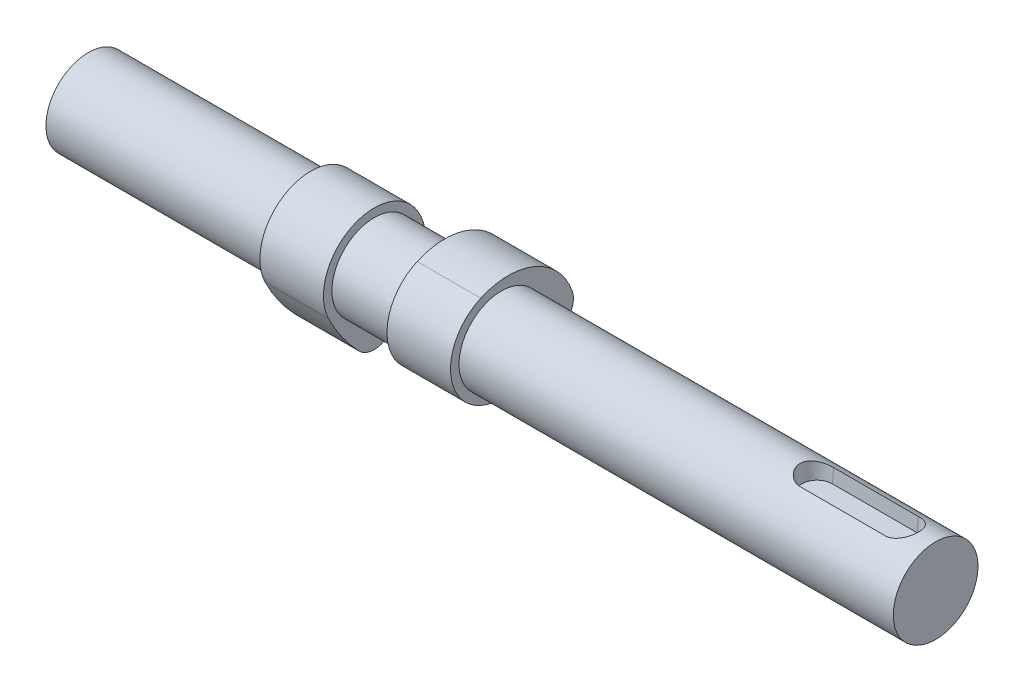
ISO-10303-21;
HEADER;
FILE_DESCRIPTION(('STEP AP214'),'2;1');
FILE_NAME('part.step','',(''),(''),'','','');
FILE_SCHEMA(('AUTOMOTIVE_DESIGN { 1 0 10303 214 1 1 1 1 }'));
ENDSEC;
DATA;
#1=APPLICATION_CONTEXT('core data for automotive mechanical design processes');
#2=APPLICATION_PROTOCOL_DEFINITION('international standard','automotive_design',2000,#1);
#3=PRODUCT_CONTEXT('',#1,'mechanical');
#4=PRODUCT('Part','Part','',(#3));
#5=PRODUCT_RELATED_PRODUCT_CATEGORY('part','',(#4));
#6=PRODUCT_DEFINITION_FORMATION('','',#4);
#7=PRODUCT_DEFINITION_CONTEXT('part definition',#1,'design');
#8=PRODUCT_DEFINITION('design','',#6,#7);
#9=PRODUCT_DEFINITION_SHAPE('','',#8);
#10=(LENGTH_UNIT() NAMED_UNIT(*) SI_UNIT(.MILLI.,.METRE.));
#11=(NAMED_UNIT(*) PLANE_ANGLE_UNIT() SI_UNIT($,.RADIAN.));
#12=(NAMED_UNIT(*) SI_UNIT($,.STERADIAN.) SOLID_ANGLE_UNIT());
#13=UNCERTAINTY_MEASURE_WITH_UNIT(LENGTH_MEASURE(1.E-05),#10,'distance_accuracy_value','');
#14=(GEOMETRIC_REPRESENTATION_CONTEXT(3) GLOBAL_UNCERTAINTY_ASSIGNED_CONTEXT((#13)) GLOBAL_UNIT_ASSIGNED_CONTEXT((#10,
#11,#12)) REPRESENTATION_CONTEXT('',''));
#15=CARTESIAN_POINT('',(0.,0.,0.));
#16=DIRECTION('',(0.,0.,1.));
#17=DIRECTION('',(1.,0.,0.));
#18=AXIS2_PLACEMENT_3D('',#15,#16,#17);
#19=CARTESIAN_POINT('',(-22.5,-1.62236318948028,3.65621904177244));
#20=DIRECTION('',(1.,0.,0.));
#21=DIRECTION('',(0.,1.,0.));
#22=AXIS2_PLACEMENT_3D('',#19,#20,#21);
#23=CYLINDRICAL_SURFACE('',#22,16.);
#24=CARTESIAN_POINT('',(-7.5,-1.62236318948028,3.65621904177244));
#25=DIRECTION('',(1.,0.,0.));
#26=DIRECTION('',(0.,1.,0.));
#27=AXIS2_PLACEMENT_3D('',#24,#25,#26);
#28=CIRCLE('',#27,16.);
#29=CARTESIAN_POINT('',(-7.5,-16.7126720366766,-1.66191774626038));
#30=VERTEX_POINT('',#29);
#31=CARTESIAN_POINT('',(-7.5,4.86708956844083,-10.9686571253173));
#32=VERTEX_POINT('',#31);
#33=EDGE_CURVE('E113',#30,#32,#28,.T.);
#34=ORIENTED_EDGE('',*,*,#33,.F.);
#35=DIRECTION('',(1.,0.,0.));
#36=VECTOR('',#35,1.);
#37=CARTESIAN_POINT('',(-22.5,-16.7126720366766,-1.66191774626038));
#38=LINE('',#37,#36);
#39=CARTESIAN_POINT('',(-22.5,-16.7126720366766,-1.66191774626038));
#40=VERTEX_POINT('',#39);
#41=EDGE_CURVE('E112',#40,#30,#38,.T.);
#42=ORIENTED_EDGE('',*,*,#41,.F.);
#43=CARTESIAN_POINT('',(-22.5,-1.62236318948028,3.65621904177244));
#44=DIRECTION('',(1.,0.,0.));
#45=DIRECTION('',(0.,1.,0.));
#46=AXIS2_PLACEMENT_3D('',#43,#44,#45);
#47=CIRCLE('',#46,16.);
#48=CARTESIAN_POINT('',(-22.5,4.86708956844083,-10.9686571253173));
#49=VERTEX_POINT('',#48);
#50=EDGE_CURVE('E107',#40,#49,#47,.T.);
#51=ORIENTED_EDGE('',*,*,#50,.T.);
#52=DIRECTION('',(1.,0.,0.));
#53=VECTOR('',#52,1.);
#54=CARTESIAN_POINT('',(-22.5,4.86708956844083,-10.9686571253173));
#55=LINE('',#54,#53);
#56=EDGE_CURVE('E12',#49,#32,#55,.T.);
#57=ORIENTED_EDGE('',*,*,#56,.T.);
#58=EDGE_LOOP('',(#34,#42,#51,#57));
#59=FACE_BOUND('',#58,.T.);
#60=ADVANCED_FACE('F50',(#59),#23,.T.);
#61=CARTESIAN_POINT('',(-22.5,0.,0.));
#62=DIRECTION('',(1.,0.,0.));
#63=DIRECTION('',(0.,1.,0.));
#64=AXIS2_PLACEMENT_3D('',#61,#62,#63);
#65=CYLINDRICAL_SURFACE('',#64,12.);
#66=CARTESIAN_POINT('',(-7.5,0.,0.));
#67=DIRECTION('',(1.,0.,0.));
#68=DIRECTION('',(0.,-1.,0.));
#69=AXIS2_PLACEMENT_3D('',#66,#67,#68);
#70=CIRCLE('',#69,12.);
#71=CARTESIAN_POINT('',(-7.5,-5.306226616829,10.7630831591536));
#72=VERTEX_POINT('',#71);
#73=EDGE_CURVE('E115',#32,#72,#70,.T.);
#74=ORIENTED_EDGE('',*,*,#73,.F.);
#75=ORIENTED_EDGE('',*,*,#56,.F.);
#76=CARTESIAN_POINT('',(-22.5,0.,0.));
#77=DIRECTION('',(1.,0.,0.));
#78=DIRECTION('',(0.,-1.,0.));
#79=AXIS2_PLACEMENT_3D('',#76,#77,#78);
#80=CIRCLE('',#79,12.);
#81=CARTESIAN_POINT('',(-22.5,-5.306226616829,10.7630831591536));
#82=VERTEX_POINT('',#81);
#83=EDGE_CURVE('E91',#49,#82,#80,.T.);
#84=ORIENTED_EDGE('',*,*,#83,.T.);
#85=DIRECTION('',(1.,0.,0.));
#86=VECTOR('',#85,1.);
#87=CARTESIAN_POINT('',(-22.5,-5.306226616829,10.7630831591536));
#88=LINE('',#87,#86);
#89=EDGE_CURVE('E58',#82,#72,#88,.T.);
#90=ORIENTED_EDGE('',*,*,#89,.T.);
#91=EDGE_LOOP('',(#74,#75,#84,#90));
#92=FACE_BOUND('',#91,.T.);
#93=ADVANCED_FACE('F105',(#92),#65,.T.);
#94=CARTESIAN_POINT('',(-22.5,12.3811954392677,-25.1138607046917));
#95=DIRECTION('',(1.,0.,0.));
#96=DIRECTION('',(0.,1.,0.));
#97=AXIS2_PLACEMENT_3D('',#94,#95,#96);
#98=CYLINDRICAL_SURFACE('',#97,40.);
#99=CARTESIAN_POINT('',(-7.5,12.3811954392677,-25.1138607046917));
#100=DIRECTION('',(1.,0.,0.));
#101=DIRECTION('',(0.,-1.,0.));
#102=AXIS2_PLACEMENT_3D('',#99,#100,#101);
#103=CIRCLE('',#102,40.);
#104=CARTESIAN_POINT('',(-7.5,-15.4795428020985,3.58769438638438));
#105=VERTEX_POINT('',#104);
#106=EDGE_CURVE('E101',#72,#105,#103,.T.);
#107=ORIENTED_EDGE('',*,*,#106,.F.);
#108=ORIENTED_EDGE('',*,*,#89,.F.);
#109=CARTESIAN_POINT('',(-22.5,12.3811954392677,-25.1138607046917));
#110=DIRECTION('',(1.,0.,0.));
#111=DIRECTION('',(0.,-1.,0.));
#112=AXIS2_PLACEMENT_3D('',#109,#110,#111);
#113=CIRCLE('',#112,40.);
#114=CARTESIAN_POINT('',(-22.5,-15.4795428020985,3.58769438638438));
#115=VERTEX_POINT('',#114);
#116=EDGE_CURVE('E94',#82,#115,#113,.T.);
#117=ORIENTED_EDGE('',*,*,#116,.T.);
#118=DIRECTION('',(1.,0.,0.));
#119=VECTOR('',#118,1.);
#120=CARTESIAN_POINT('',(-22.5,-15.4795428020985,3.58769438638438));
#121=LINE('',#120,#119);
#122=EDGE_CURVE('E104',#115,#105,#121,.T.);
#123=ORIENTED_EDGE('',*,*,#122,.T.);
#124=EDGE_LOOP('',(#107,#108,#117,#123));
#125=FACE_BOUND('',#124,.T.);
#126=ADVANCED_FACE('F100',(#125),#98,.T.);
#127=CARTESIAN_POINT('',(-22.5,-11.9969505219278,-1.25661386611005E-13));
#128=DIRECTION('',(1.,0.,0.));
#129=DIRECTION('',(0.,1.,0.));
#130=AXIS2_PLACEMENT_3D('',#127,#128,#129);
#131=CYLINDRICAL_SURFACE('',#130,5.);
#132=CARTESIAN_POINT('',(-7.5,-11.9969505219278,-1.25661386611005E-13));
#133=DIRECTION('',(1.,0.,0.));
#134=DIRECTION('',(0.,1.,0.));
#135=AXIS2_PLACEMENT_3D('',#132,#133,#134);
#136=CIRCLE('',#135,5.);
#137=EDGE_CURVE('E80',#105,#30,#136,.T.);
#138=ORIENTED_EDGE('',*,*,#137,.F.);
#139=ORIENTED_EDGE('',*,*,#122,.F.);
#140=CARTESIAN_POINT('',(-22.5,-11.9969505219278,-1.25661386611005E-13));
#141=DIRECTION('',(1.,0.,0.));
#142=DIRECTION('',(0.,1.,0.));
#143=AXIS2_PLACEMENT_3D('',#140,#141,#142);
#144=CIRCLE('',#143,5.);
#145=EDGE_CURVE('E66',#115,#40,#144,.T.);
#146=ORIENTED_EDGE('',*,*,#145,.T.);
#147=ORIENTED_EDGE('',*,*,#41,.T.);
#148=EDGE_LOOP('',(#138,#139,#146,#147));
#149=FACE_BOUND('',#148,.T.);
#150=ADVANCED_FACE('F124',(#149),#131,.T.);
#151=CARTESIAN_POINT('',(-22.5,-6.80965685570402,1.82810952088616));
#152=DIRECTION('',(1.,0.,0.));
#153=DIRECTION('',(0.,1.,0.));
#154=AXIS2_PLACEMENT_3D('',#151,#152,#153);
#155=PLANE('',#154);
#156=ORIENTED_EDGE('',*,*,#50,.F.);
#157=ORIENTED_EDGE('',*,*,#145,.F.);
#158=ORIENTED_EDGE('',*,*,#116,.F.);
#159=ORIENTED_EDGE('',*,*,#83,.F.);
#160=EDGE_LOOP('',(#156,#157,#158,#159));
#161=FACE_BOUND('',#160,.T.);
#162=ADVANCED_FACE('F96',(#161),#155,.F.);
#163=CARTESIAN_POINT('',(-7.5,-6.80965685570402,1.82810952088616));
#164=DIRECTION('',(1.,0.,0.));
#165=DIRECTION('',(0.,1.,0.));
#166=AXIS2_PLACEMENT_3D('',#163,#164,#165);
#167=PLANE('',#166);
#168=ORIENTED_EDGE('',*,*,#33,.T.);
#169=ORIENTED_EDGE('',*,*,#73,.T.);
#170=ORIENTED_EDGE('',*,*,#106,.T.);
#171=ORIENTED_EDGE('',*,*,#137,.T.);
#172=EDGE_LOOP('',(#168,#169,#170,#171));
#173=FACE_BOUND('',#172,.T.);
#174=ADVANCED_FACE('F120',(#173),#167,.T.);
#175=CLOSED_SHELL('',(#60,#93,#126,#150,#162,#174));
#176=MANIFOLD_SOLID_BREP('B2',#175);
#177=CARTESIAN_POINT('',(22.5,-3.65621904177246,-1.62236318948024));
#178=DIRECTION('',(-1.,0.,0.));
#179=DIRECTION('',(0.,0.,1.));
#180=AXIS2_PLACEMENT_3D('',#177,#178,#179);
#181=CYLINDRICAL_SURFACE('',#180,16.);
#182=CARTESIAN_POINT('',(7.5,-3.65621904177246,-1.62236318948024));
#183=DIRECTION('',(1.,0.,0.));
#184=DIRECTION('',(0.,0.,1.));
#185=AXIS2_PLACEMENT_3D('',#182,#183,#184);
#186=CIRCLE('',#185,16.);
#187=CARTESIAN_POINT('',(7.5,1.66191774626021,-16.7126720366766));
#188=VERTEX_POINT('',#187);
#189=CARTESIAN_POINT('',(7.5,10.9686571253174,4.86708956844071));
#190=VERTEX_POINT('',#189);
#191=EDGE_CURVE('E246',#188,#190,#186,.T.);
#192=ORIENTED_EDGE('',*,*,#191,.T.);
#193=DIRECTION('',(-1.,0.,0.));
#194=VECTOR('',#193,1.);
#195=CARTESIAN_POINT('',(22.5,10.9686571253174,4.86708956844071));
#196=LINE('',#195,#194);
#197=CARTESIAN_POINT('',(22.5,10.9686571253174,4.86708956844071));
#198=VERTEX_POINT('',#197);
#199=EDGE_CURVE('E48',#198,#190,#196,.T.);
#200=ORIENTED_EDGE('',*,*,#199,.F.);
#201=CARTESIAN_POINT('',(22.5,-3.65621904177246,-1.62236318948024));
#202=DIRECTION('',(1.,0.,0.));
#203=DIRECTION('',(0.,0.,1.));
#204=AXIS2_PLACEMENT_3D('',#201,#202,#203);
#205=CIRCLE('',#204,16.);
#206=CARTESIAN_POINT('',(22.5,1.66191774626021,-16.7126720366766));
#207=VERTEX_POINT('',#206);
#208=EDGE_CURVE('E234',#207,#198,#205,.T.);
#209=ORIENTED_EDGE('',*,*,#208,.F.);
#210=DIRECTION('',(-1.,0.,0.));
#211=VECTOR('',#210,1.);
#212=CARTESIAN_POINT('',(22.5,1.66191774626021,-16.7126720366766));
#213=LINE('',#212,#211);
#214=EDGE_CURVE('E242',#207,#188,#213,.T.);
#215=ORIENTED_EDGE('',*,*,#214,.T.);
#216=EDGE_LOOP('',(#192,#200,#209,#215));
#217=FACE_BOUND('',#216,.T.);
#218=ADVANCED_FACE('F183',(#217),#181,.T.);
#219=CARTESIAN_POINT('',(22.5,0.,0.));
#220=DIRECTION('',(-1.,0.,0.));
#221=DIRECTION('',(0.,0.,1.));
#222=AXIS2_PLACEMENT_3D('',#219,#220,#221);
#223=CYLINDRICAL_SURFACE('',#222,12.);
#224=CARTESIAN_POINT('',(7.5,0.,0.));
#225=DIRECTION('',(1.,0.,0.));
#226=DIRECTION('',(0.,0.,-1.));
#227=AXIS2_PLACEMENT_3D('',#224,#225,#226);
#228=CIRCLE('',#227,12.);
#229=CARTESIAN_POINT('',(7.5,-10.7630831591536,-5.30622661682889));
#230=VERTEX_POINT('',#229);
#231=EDGE_CURVE('E238',#190,#230,#228,.T.);
#232=ORIENTED_EDGE('',*,*,#231,.T.);
#233=DIRECTION('',(-1.,0.,0.));
#234=VECTOR('',#233,1.);
#235=CARTESIAN_POINT('',(22.5,-10.7630831591536,-5.30622661682889));
#236=LINE('',#235,#234);
#237=CARTESIAN_POINT('',(22.5,-10.7630831591536,-5.30622661682889));
#238=VERTEX_POINT('',#237);
#239=EDGE_CURVE('E191',#238,#230,#236,.T.);
#240=ORIENTED_EDGE('',*,*,#239,.F.);
#241=CARTESIAN_POINT('',(22.5,0.,0.));
#242=DIRECTION('',(1.,0.,0.));
#243=DIRECTION('',(0.,0.,-1.));
#244=AXIS2_PLACEMENT_3D('',#241,#242,#243);
#245=CIRCLE('',#244,12.);
#246=EDGE_CURVE('E229',#198,#238,#245,.T.);
#247=ORIENTED_EDGE('',*,*,#246,.F.);
#248=ORIENTED_EDGE('',*,*,#199,.T.);
#249=EDGE_LOOP('',(#232,#240,#247,#248));
#250=FACE_BOUND('',#249,.T.);
#251=ADVANCED_FACE('F237',(#250),#223,.T.);
#252=CARTESIAN_POINT('',(22.5,25.1138607046918,12.3811954392674));
#253=DIRECTION('',(-1.,0.,0.));
#254=DIRECTION('',(0.,0.,1.));
#255=AXIS2_PLACEMENT_3D('',#252,#253,#254);
#256=CYLINDRICAL_SURFACE('',#255,40.);
#257=CARTESIAN_POINT('',(7.5,25.1138607046918,12.3811954392674));
#258=DIRECTION('',(1.,0.,0.));
#259=DIRECTION('',(0.,0.,-1.));
#260=AXIS2_PLACEMENT_3D('',#257,#258,#259);
#261=CIRCLE('',#260,40.);
#262=CARTESIAN_POINT('',(7.5,-3.58769438638454,-15.4795428020985));
#263=VERTEX_POINT('',#262);
#264=EDGE_CURVE('E216',#230,#263,#261,.T.);
#265=ORIENTED_EDGE('',*,*,#264,.T.);
#266=DIRECTION('',(-1.,0.,0.));
#267=VECTOR('',#266,1.);
#268=CARTESIAN_POINT('',(22.5,-3.58769438638454,-15.4795428020985));
#269=LINE('',#268,#267);
#270=CARTESIAN_POINT('',(22.5,-3.58769438638454,-15.4795428020985));
#271=VERTEX_POINT('',#270);
#272=EDGE_CURVE('E239',#271,#263,#269,.T.);
#273=ORIENTED_EDGE('',*,*,#272,.F.);
#274=CARTESIAN_POINT('',(22.5,25.1138607046918,12.3811954392674));
#275=DIRECTION('',(1.,0.,0.));
#276=DIRECTION('',(0.,0.,-1.));
#277=AXIS2_PLACEMENT_3D('',#274,#275,#276);
#278=CIRCLE('',#277,40.);
#279=EDGE_CURVE('E232',#238,#271,#278,.T.);
#280=ORIENTED_EDGE('',*,*,#279,.F.);
#281=ORIENTED_EDGE('',*,*,#239,.T.);
#282=EDGE_LOOP('',(#265,#273,#280,#281));
#283=FACE_BOUND('',#282,.T.);
#284=ADVANCED_FACE('F240',(#283),#256,.T.);
#285=CARTESIAN_POINT('',(22.5,0.,-11.9969505219278));
#286=DIRECTION('',(-1.,0.,0.));
#287=DIRECTION('',(0.,0.,1.));
#288=AXIS2_PLACEMENT_3D('',#285,#286,#287);
#289=CYLINDRICAL_SURFACE('',#288,5.);
#290=CARTESIAN_POINT('',(7.5,0.,-11.9969505219278));
#291=DIRECTION('',(1.,0.,0.));
#292=DIRECTION('',(0.,0.,1.));
#293=AXIS2_PLACEMENT_3D('',#290,#291,#292);
#294=CIRCLE('',#293,5.);
#295=EDGE_CURVE('E222',#263,#188,#294,.T.);
#296=ORIENTED_EDGE('',*,*,#295,.T.);
#297=ORIENTED_EDGE('',*,*,#214,.F.);
#298=CARTESIAN_POINT('',(22.5,0.,-11.9969505219278));
#299=DIRECTION('',(1.,0.,0.));
#300=DIRECTION('',(0.,0.,1.));
#301=AXIS2_PLACEMENT_3D('',#298,#299,#300);
#302=CIRCLE('',#301,5.);
#303=EDGE_CURVE('E199',#271,#207,#302,.T.);
#304=ORIENTED_EDGE('',*,*,#303,.F.);
#305=ORIENTED_EDGE('',*,*,#272,.T.);
#306=EDGE_LOOP('',(#296,#297,#304,#305));
#307=FACE_BOUND('',#306,.T.);
#308=ADVANCED_FACE('F253',(#307),#289,.T.);
#309=CARTESIAN_POINT('',(22.5,-1.82810952088623,-6.809656855704));
#310=DIRECTION('',(-1.,0.,0.));
#311=DIRECTION('',(0.,0.,1.));
#312=AXIS2_PLACEMENT_3D('',#309,#310,#311);
#313=PLANE('',#312);
#314=ORIENTED_EDGE('',*,*,#208,.T.);
#315=ORIENTED_EDGE('',*,*,#246,.T.);
#316=ORIENTED_EDGE('',*,*,#279,.T.);
#317=ORIENTED_EDGE('',*,*,#303,.T.);
#318=EDGE_LOOP('',(#314,#315,#316,#317));
#319=FACE_BOUND('',#318,.T.);
#320=ADVANCED_FACE('F230',(#319),#313,.F.);
#321=CARTESIAN_POINT('',(7.5,-1.82810952088623,-6.809656855704));
#322=DIRECTION('',(-1.,0.,0.));
#323=DIRECTION('',(0.,0.,1.));
#324=AXIS2_PLACEMENT_3D('',#321,#322,#323);
#325=PLANE('',#324);
#326=ORIENTED_EDGE('',*,*,#191,.F.);
#327=ORIENTED_EDGE('',*,*,#295,.F.);
#328=ORIENTED_EDGE('',*,*,#264,.F.);
#329=ORIENTED_EDGE('',*,*,#231,.F.);
#330=EDGE_LOOP('',(#326,#327,#328,#329));
#331=FACE_BOUND('',#330,.T.);
#332=ADVANCED_FACE('F256',(#331),#325,.T.);
#333=CLOSED_SHELL('',(#218,#251,#284,#308,#320,#332));
#334=MANIFOLD_SOLID_BREP('B6',#333);
#335=CARTESIAN_POINT('',(-75.,0.,0.));
#336=DIRECTION('',(1.,0.,0.));
#337=DIRECTION('',(0.,0.,-1.));
#338=AXIS2_PLACEMENT_3D('',#335,#336,#337);
#339=CYLINDRICAL_SURFACE('',#338,10.);
#340=CARTESIAN_POINT('',(116.9998,9.19554732162667,3.92961950520971));
#341=CARTESIAN_POINT('',(117.108432526229,9.19552396461699,3.92963900895938));
#342=CARTESIAN_POINT('',(117.217054442407,9.19739790113637,3.92528821148888));
#343=CARTESIAN_POINT('',(117.433449189068,9.20478322107422,3.90795696349252));
#344=CARTESIAN_POINT('',(117.541222281507,9.21029343390919,3.89497929010511));
#345=CARTESIAN_POINT('',(117.754805249896,9.22477014169951,3.86056266999496));
#346=CARTESIAN_POINT('',(117.860620479704,9.23372503404509,3.83915212174359));
#347=CARTESIAN_POINT('',(118.069896437043,9.25479066145063,3.78808770588497));
#348=CARTESIAN_POINT('',(118.173357048389,9.26690155187349,3.75843343245227));
#349=CARTESIAN_POINT('',(118.478997114603,9.30741193624863,3.65751207972482));
#350=CARTESIAN_POINT('',(118.676801412905,9.34001597020544,3.57422665843843));
#351=CARTESIAN_POINT('',(119.055656727802,9.41272444967854,3.37809141880251));
#352=CARTESIAN_POINT('',(119.236694043575,9.45283494952219,3.26521770641159));
#353=CARTESIAN_POINT('',(119.586163210606,9.53832850590639,3.00660395270599));
#354=CARTESIAN_POINT('',(119.75359745749,9.58387103250205,2.85956460575029));
#355=CARTESIAN_POINT('',(120.06167183687,9.67365894564606,2.53928149200147));
#356=CARTESIAN_POINT('',(120.202307528385,9.7179041161741,2.36603339048636));
#357=CARTESIAN_POINT('',(120.455271105667,9.80118313396661,1.99346714637655));
#358=CARTESIAN_POINT('',(120.566978377658,9.8400954262747,1.79369791629398));
#359=CARTESIAN_POINT('',(120.754126120008,9.90710575454471,1.37616732968246));
#360=CARTESIAN_POINT('',(120.829586514252,9.93520972983524,1.15841593476275));
#361=CARTESIAN_POINT('',(120.937423647946,9.97586398416612,0.725552222129559));
#362=CARTESIAN_POINT('',(120.972183980034,9.98927144663287,0.511115107829933));
#363=CARTESIAN_POINT('',(121.005253036647,10.0020189726074,0.0790606490660708));
#364=CARTESIAN_POINT('',(121.003575139474,10.0013641990691,-0.138555498890743));
#365=CARTESIAN_POINT('',(120.965065772481,9.98653634618633,-0.55713437731378));
#366=CARTESIAN_POINT('',(120.930314495065,9.97316323800987,-0.758322063329802));
#367=CARTESIAN_POINT('',(120.830073130865,9.93541593559446,-1.15177617887117));
#368=CARTESIAN_POINT('',(120.764581003034,9.91104101089147,-1.34404201509667));
#369=CARTESIAN_POINT('',(120.603676754373,9.8530923067776,-1.71848117040827));
#370=CARTESIAN_POINT('',(120.50772071095,9.81935282430629,-1.90039390354836));
#371=CARTESIAN_POINT('',(120.289247885583,9.74606742103519,-2.24621081177601));
#372=CARTESIAN_POINT('',(120.166721786218,9.70651946492988,-2.41010863904958));
#373=CARTESIAN_POINT('',(119.888474496445,9.62225347352947,-2.72785507367911));
#374=CARTESIAN_POINT('',(119.730991599461,9.57736844831364,-2.88011561690002));
#375=CARTESIAN_POINT('',(119.39269852426,9.48965886456742,-3.15714116902367));
#376=CARTESIAN_POINT('',(119.211877236817,9.44683530072072,-3.28189300651247));
#377=CARTESIAN_POINT('',(118.922606169477,9.38686542506334,-3.44824964477365));
#378=CARTESIAN_POINT('',(118.820957447824,9.36724202522513,-3.50106618947219));
#379=CARTESIAN_POINT('',(118.613181248028,9.33044058072898,-3.5979946757925));
#380=CARTESIAN_POINT('',(118.507055578203,9.31326156077457,-3.64211009185354));
#381=CARTESIAN_POINT('',(118.291154422689,9.28193522243321,-3.72122180241614));
#382=CARTESIAN_POINT('',(118.181382861742,9.26778475870701,-3.75622756608453));
#383=CARTESIAN_POINT('',(117.958933082548,9.24298582877054,-3.81684131432378));
#384=CARTESIAN_POINT('',(117.846256085105,9.23233591674958,-3.84245317930481));
#385=CARTESIAN_POINT('',(117.611930809076,9.21440060696265,-3.88528372873352));
#386=CARTESIAN_POINT('',(117.490152858103,9.20735840438907,-3.90189924806992));
#387=CARTESIAN_POINT('',(117.245519514609,9.19791466072453,-3.92407823700824));
#388=CARTESIAN_POINT('',(117.122665085282,9.19550932696913,-3.92965073920191));
#389=CARTESIAN_POINT('',(116.9998,9.19554732162666,-3.92961950520972));
#390=B_SPLINE_CURVE_WITH_KNOTS('',3,(#340,#341,#342,#343,#344,#345,#346,#347,#348,#349,#350,
#351,#352,#353,#354,#355,#356,#357,#358,#359,#360,#361,#362,#363,#364,#365,#366,#367,#368,#369,
#370,#371,#372,#373,#374,#375,#376,#377,#378,#379,#380,#381,#382,#383,#384,#385,#386,#387,#388,
#389),.UNSPECIFIED.,.F.,.F.,(4,2,2,2,2,2,2,2,2,2,2,2,2,2,2,2,2,2,2,2,2,2,2,2,4),(0.,
0.325775853756532,0.651446885464914,0.976030440919044,1.3006299779342,1.94872565760357,
2.59734632832017,3.27656669617222,3.9558995248008,4.64878303442881,5.34128524851461,
5.99080148182277,6.64007924914105,7.25104428619564,7.86204989415494,8.48464423808043,
9.10745726360786,9.77538752835235,10.4436369129641,10.7919327546046,11.1400892357431,
11.4878823615824,11.8355316596004,12.2042630896941,12.5726927926964),.UNSPECIFIED.);
#391=CARTESIAN_POINT('',(117.,9.19554731953007,3.92961951011584));
#392=VERTEX_POINT('',#391);
#393=CARTESIAN_POINT('',(117.,9.19554731953009,-3.92961951011584));
#394=VERTEX_POINT('',#393);
#395=EDGE_CURVE('E382',#392,#394,#390,.T.);
#396=ORIENTED_EDGE('',*,*,#395,.F.);
#397=DIRECTION('',(1.,0.,0.));
#398=VECTOR('',#397,1.);
#399=CARTESIAN_POINT('',(-75.,9.19554731953007,3.92961951011589));
#400=LINE('',#399,#398);
#401=CARTESIAN_POINT('',(97.,9.19554731953009,3.92961951011584));
#402=VERTEX_POINT('',#401);
#403=EDGE_CURVE('E181',#402,#392,#400,.T.);
#404=ORIENTED_EDGE('',*,*,#403,.F.);
#405=CARTESIAN_POINT('',(97.0002,9.19554732162667,-3.92961950520971));
#406=CARTESIAN_POINT('',(96.8915674737709,9.19552396461699,-3.92963900895938));
#407=CARTESIAN_POINT('',(96.7829455575925,9.19739790113637,-3.92528821148888));
#408=CARTESIAN_POINT('',(96.5665508109321,9.20478322107422,-3.90795696349252));
#409=CARTESIAN_POINT('',(96.4587777184928,9.21029343390919,-3.89497929010511));
#410=CARTESIAN_POINT('',(96.2451947501037,9.22477014169951,-3.86056266999496));
#411=CARTESIAN_POINT('',(96.1393795202961,9.23372503404509,-3.83915212174359));
#412=CARTESIAN_POINT('',(95.9301035629571,9.25479066145063,-3.78808770588497));
#413=CARTESIAN_POINT('',(95.8266429516112,9.26690155187349,-3.75843343245227));
#414=CARTESIAN_POINT('',(95.5210028853967,9.30741193624863,-3.65751207972481));
#415=CARTESIAN_POINT('',(95.3231985870946,9.34001597020544,-3.57422665843843));
#416=CARTESIAN_POINT('',(94.9443432721979,9.41272444967854,-3.3780914188025));
#417=CARTESIAN_POINT('',(94.7633059564248,9.45283494952219,-3.26521770641159));
#418=CARTESIAN_POINT('',(94.413836789394,9.53832850590639,-3.00660395270599));
#419=CARTESIAN_POINT('',(94.2464025425101,9.58387103250205,-2.85956460575029));
#420=CARTESIAN_POINT('',(93.9383281631304,9.67365894564606,-2.53928149200146));
#421=CARTESIAN_POINT('',(93.7976924716152,9.7179041161741,-2.36603339048636));
#422=CARTESIAN_POINT('',(93.544728894333,9.80118313396661,-1.99346714637655));
#423=CARTESIAN_POINT('',(93.4330216223424,9.84009542627471,-1.79369791629397));
#424=CARTESIAN_POINT('',(93.2458738799919,9.90710575454472,-1.37616732968245));
#425=CARTESIAN_POINT('',(93.1704134857481,9.93520972983524,-1.15841593476274));
#426=CARTESIAN_POINT('',(93.0625763520545,9.97586398416612,-0.725552222129557));
#427=CARTESIAN_POINT('',(93.0278160199655,9.98927144663287,-0.511115107829931));
#428=CARTESIAN_POINT('',(92.9947469633532,10.0020189726074,-0.0790606490660684));
#429=CARTESIAN_POINT('',(92.9964248605263,10.0013641990691,0.138555498890746));
#430=CARTESIAN_POINT('',(93.0349342275193,9.98653634618633,0.557134377313782));
#431=CARTESIAN_POINT('',(93.0696855049347,9.97316323800987,0.758322063329803));
#432=CARTESIAN_POINT('',(93.1699268691349,9.93541593559446,1.15177617887117));
#433=CARTESIAN_POINT('',(93.2354189969656,9.91104101089147,1.34404201509667));
#434=CARTESIAN_POINT('',(93.3963232456273,9.8530923067776,1.71848117040827));
#435=CARTESIAN_POINT('',(93.4922792890503,9.81935282430629,1.90039390354835));
#436=CARTESIAN_POINT('',(93.7107521144166,9.74606742103519,2.24621081177601));
#437=CARTESIAN_POINT('',(93.8332782137822,9.70651946492988,2.41010863904958));
#438=CARTESIAN_POINT('',(94.1115255035547,9.62225347352947,2.7278550736791));
#439=CARTESIAN_POINT('',(94.2690084005388,9.57736844831365,2.88011561690001));
#440=CARTESIAN_POINT('',(94.6073014757403,9.48965886456742,3.15714116902367));
#441=CARTESIAN_POINT('',(94.7881227631832,9.44683530072072,3.28189300651247));
#442=CARTESIAN_POINT('',(95.0773938305227,9.38686542506334,3.44824964477366));
#443=CARTESIAN_POINT('',(95.1790425521757,9.36724202522513,3.5010661894722));
#444=CARTESIAN_POINT('',(95.386818751972,9.33044058072897,3.59799467579251));
#445=CARTESIAN_POINT('',(95.4929444217969,9.31326156077457,3.64211009185354));
#446=CARTESIAN_POINT('',(95.7088455773114,9.28193522243321,3.72122180241615));
#447=CARTESIAN_POINT('',(95.8186171382581,9.26778475870701,3.75622756608454));
#448=CARTESIAN_POINT('',(96.0410669174523,9.24298582877054,3.81684131432379));
#449=CARTESIAN_POINT('',(96.1537439148955,9.23233591674958,3.84245317930481));
#450=CARTESIAN_POINT('',(96.388069190924,9.21440060696265,3.88528372873353));
#451=CARTESIAN_POINT('',(96.5098471418972,9.20735840438907,3.90189924806992));
#452=CARTESIAN_POINT('',(96.7544804853914,9.19791466072453,3.92407823700824));
#453=CARTESIAN_POINT('',(96.8773349147178,9.19550932696913,3.92965073920191));
#454=CARTESIAN_POINT('',(97.0002,9.19554732162666,3.92961950520972));
#455=B_SPLINE_CURVE_WITH_KNOTS('',3,(#405,#406,#407,#408,#409,#410,#411,#412,#413,#414,#415,
#416,#417,#418,#419,#420,#421,#422,#423,#424,#425,#426,#427,#428,#429,#430,#431,#432,#433,#434,
#435,#436,#437,#438,#439,#440,#441,#442,#443,#444,#445,#446,#447,#448,#449,#450,#451,#452,#453,
#454),.UNSPECIFIED.,.F.,.F.,(4,2,2,2,2,2,2,2,2,2,2,2,2,2,2,2,2,2,2,2,2,2,2,2,4),(0.,
0.325775853756532,0.6514468854649,0.97603044091903,1.3006299779342,1.94872565760357,
2.59734632832017,3.27656669617222,3.9558995248008,4.64878303442882,5.34128524851461,
5.99080148182277,6.64007924914105,7.25104428619564,7.86204989415494,8.48464423808042,
9.10745726360786,9.77538752835234,10.4436369129641,10.7919327546046,11.1400892357431,
11.4878823615824,11.8355316596004,12.2042630896941,12.5726927926964),.UNSPECIFIED.);
#456=CARTESIAN_POINT('',(97.,9.1955473195301,-3.92961951011584));
#457=VERTEX_POINT('',#456);
#458=EDGE_CURVE('E315',#457,#402,#455,.T.);
#459=ORIENTED_EDGE('',*,*,#458,.F.);
#460=DIRECTION('',(1.,0.,0.));
#461=VECTOR('',#460,1.);
#462=CARTESIAN_POINT('',(-75.,9.19554731953011,-3.92961951011579));
#463=LINE('',#462,#461);
#464=EDGE_CURVE('E354',#394,#457,#463,.F.);
#465=ORIENTED_EDGE('',*,*,#464,.F.);
#466=EDGE_LOOP('',(#396,#404,#459,#465));
#467=FACE_BOUND('',#466,.T.);
#468=CARTESIAN_POINT('',(-75.,0.,0.));
#469=DIRECTION('',(1.,0.,0.));
#470=DIRECTION('',(0.,0.,-1.));
#471=AXIS2_PLACEMENT_3D('',#468,#469,#470);
#472=CIRCLE('',#471,10.);
#473=CARTESIAN_POINT('',(-75.,0.,-10.));
#474=VERTEX_POINT('',#473);
#475=EDGE_CURVE('E379',#474,#474,#472,.T.);
#476=ORIENTED_EDGE('',*,*,#475,.T.);
#477=EDGE_LOOP('',(#476));
#478=FACE_BOUND('',#477,.T.);
#479=CARTESIAN_POINT('',(125.,0.,0.));
#480=DIRECTION('',(1.,0.,0.));
#481=DIRECTION('',(0.,0.,-1.));
#482=AXIS2_PLACEMENT_3D('',#479,#480,#481);
#483=CIRCLE('',#482,10.);
#484=CARTESIAN_POINT('',(125.,0.,-10.));
#485=VERTEX_POINT('',#484);
#486=EDGE_CURVE('E356',#485,#485,#483,.T.);
#487=ORIENTED_EDGE('',*,*,#486,.F.);
#488=EDGE_LOOP('',(#487));
#489=FACE_BOUND('',#488,.T.);
#490=ADVANCED_FACE('F307',(#467,#478,#489),#339,.T.);
#491=CARTESIAN_POINT('',(-75.,0.,0.));
#492=DIRECTION('',(1.,0.,0.));
#493=DIRECTION('',(0.,0.,-1.));
#494=AXIS2_PLACEMENT_3D('',#491,#492,#493);
#495=PLANE('',#494);
#496=ORIENTED_EDGE('',*,*,#475,.F.);
#497=EDGE_LOOP('',(#496));
#498=FACE_BOUND('',#497,.T.);
#499=ADVANCED_FACE('F401',(#498),#495,.F.);
#500=CARTESIAN_POINT('',(125.,0.,0.));
#501=DIRECTION('',(1.,0.,0.));
#502=DIRECTION('',(0.,0.,-1.));
#503=AXIS2_PLACEMENT_3D('',#500,#501,#502);
#504=PLANE('',#503);
#505=ORIENTED_EDGE('',*,*,#486,.T.);
#506=EDGE_LOOP('',(#505));
#507=FACE_BOUND('',#506,.T.);
#508=ADVANCED_FACE('F399',(#507),#504,.T.);
#509=CARTESIAN_POINT('',(97.,10.,0.));
#510=DIRECTION('',(0.,1.,0.));
#511=DIRECTION('',(0.,0.,1.));
#512=AXIS2_PLACEMENT_3D('',#509,#510,#511);
#513=CONICAL_SURFACE('',#512,4.,0.0872664625997167);
#514=DIRECTION('',(0.,0.996194698091745,-0.0871557427476584));
#515=VECTOR('',#514,1.);
#516=CARTESIAN_POINT('',(97.,10.,-4.));
#517=LINE('',#516,#515);
#518=CARTESIAN_POINT('',(97.,6.,-3.6500453458963));
#519=VERTEX_POINT('',#518);
#520=EDGE_CURVE('E348',#519,#457,#517,.T.);
#521=ORIENTED_EDGE('',*,*,#520,.T.);
#522=ORIENTED_EDGE('',*,*,#458,.T.);
#523=DIRECTION('',(0.,0.996194698091745,0.0871557427476584));
#524=VECTOR('',#523,1.);
#525=CARTESIAN_POINT('',(97.,10.,4.00000000000001));
#526=LINE('',#525,#524);
#527=CARTESIAN_POINT('',(97.,6.,3.65004534589631));
#528=VERTEX_POINT('',#527);
#529=EDGE_CURVE('E321',#528,#402,#526,.T.);
#530=ORIENTED_EDGE('',*,*,#529,.F.);
#531=CARTESIAN_POINT('',(97.,6.,0.));
#532=DIRECTION('',(0.,1.,0.));
#533=DIRECTION('',(0.,0.,1.));
#534=AXIS2_PLACEMENT_3D('',#531,#532,#533);
#535=CIRCLE('',#534,3.6500453458963);
#536=EDGE_CURVE('E360',#519,#528,#535,.T.);
#537=ORIENTED_EDGE('',*,*,#536,.F.);
#538=EDGE_LOOP('',(#521,#522,#530,#537));
#539=FACE_BOUND('',#538,.T.);
#540=ADVANCED_FACE('F361',(#539),#513,.F.);
#541=CARTESIAN_POINT('',(97.,10.,-4.));
#542=DIRECTION('',(0.,-0.0871557427476584,-0.996194698091746));
#543=DIRECTION('',(0.,0.996194698091746,-0.0871557427476584));
#544=AXIS2_PLACEMENT_3D('',#541,#542,#543);
#545=PLANE('',#544);
#546=ORIENTED_EDGE('',*,*,#464,.T.);
#547=ORIENTED_EDGE('',*,*,#520,.F.);
#548=DIRECTION('',(-1.,0.,0.));
#549=VECTOR('',#548,1.);
#550=CARTESIAN_POINT('',(97.,6.,-3.6500453458963));
#551=LINE('',#550,#549);
#552=CARTESIAN_POINT('',(117.,6.,-3.65004534589631));
#553=VERTEX_POINT('',#552);
#554=EDGE_CURVE('E353',#553,#519,#551,.T.);
#555=ORIENTED_EDGE('',*,*,#554,.F.);
#556=DIRECTION('',(0.,0.996194698091745,-0.0871557427476584));
#557=VECTOR('',#556,1.);
#558=CARTESIAN_POINT('',(117.,10.,-4.));
#559=LINE('',#558,#557);
#560=EDGE_CURVE('E357',#553,#394,#559,.T.);
#561=ORIENTED_EDGE('',*,*,#560,.T.);
#562=EDGE_LOOP('',(#546,#547,#555,#561));
#563=FACE_BOUND('',#562,.T.);
#564=ADVANCED_FACE('F350',(#563),#545,.F.);
#565=CARTESIAN_POINT('',(117.,10.,0.));
#566=DIRECTION('',(0.,1.,0.));
#567=DIRECTION('',(0.,0.,1.));
#568=AXIS2_PLACEMENT_3D('',#565,#566,#567);
#569=CONICAL_SURFACE('',#568,4.,0.0872664625997167);
#570=DIRECTION('',(0.,0.996194698091745,0.0871557427476584));
#571=VECTOR('',#570,1.);
#572=CARTESIAN_POINT('',(117.,10.,4.));
#573=LINE('',#572,#571);
#574=CARTESIAN_POINT('',(117.,6.,3.6500453458963));
#575=VERTEX_POINT('',#574);
#576=EDGE_CURVE('E371',#575,#392,#573,.T.);
#577=ORIENTED_EDGE('',*,*,#576,.T.);
#578=ORIENTED_EDGE('',*,*,#395,.T.);
#579=ORIENTED_EDGE('',*,*,#560,.F.);
#580=CARTESIAN_POINT('',(117.,6.,0.));
#581=DIRECTION('',(0.,1.,0.));
#582=DIRECTION('',(0.,0.,1.));
#583=AXIS2_PLACEMENT_3D('',#580,#581,#582);
#584=CIRCLE('',#583,3.6500453458963);
#585=EDGE_CURVE('E369',#575,#553,#584,.T.);
#586=ORIENTED_EDGE('',*,*,#585,.F.);
#587=EDGE_LOOP('',(#577,#578,#579,#586));
#588=FACE_BOUND('',#587,.T.);
#589=ADVANCED_FACE('F389',(#588),#569,.F.);
#590=CARTESIAN_POINT('',(97.,10.,4.00000000000001));
#591=DIRECTION('',(0.,-0.0871557427476584,0.996194698091746));
#592=DIRECTION('',(0.,-0.996194698091746,-0.0871557427476584));
#593=AXIS2_PLACEMENT_3D('',#590,#591,#592);
#594=PLANE('',#593);
#595=ORIENTED_EDGE('',*,*,#403,.T.);
#596=ORIENTED_EDGE('',*,*,#576,.F.);
#597=DIRECTION('',(1.,0.,0.));
#598=VECTOR('',#597,1.);
#599=CARTESIAN_POINT('',(97.,6.,3.65004534589631));
#600=LINE('',#599,#598);
#601=EDGE_CURVE('E364',#528,#575,#600,.T.);
#602=ORIENTED_EDGE('',*,*,#601,.F.);
#603=ORIENTED_EDGE('',*,*,#529,.T.);
#604=EDGE_LOOP('',(#595,#596,#602,#603));
#605=FACE_BOUND('',#604,.T.);
#606=ADVANCED_FACE('F394',(#605),#594,.F.);
#607=CARTESIAN_POINT('',(97.,6.,0.));
#608=DIRECTION('',(0.,1.,0.));
#609=DIRECTION('',(0.,0.,1.));
#610=AXIS2_PLACEMENT_3D('',#607,#608,#609);
#611=PLANE('',#610);
#612=ORIENTED_EDGE('',*,*,#536,.T.);
#613=ORIENTED_EDGE('',*,*,#601,.T.);
#614=ORIENTED_EDGE('',*,*,#585,.T.);
#615=ORIENTED_EDGE('',*,*,#554,.T.);
#616=EDGE_LOOP('',(#612,#613,#614,#615));
#617=FACE_BOUND('',#616,.T.);
#618=ADVANCED_FACE('F367',(#617),#611,.T.);
#619=CLOSED_SHELL('',(#490,#499,#508,#540,#564,#589,#606,#618));
#620=MANIFOLD_SOLID_BREP('B42',#619);
#621=ADVANCED_BREP_SHAPE_REPRESENTATION('',(#18,#176,#334,#620),#14);
#622=SHAPE_DEFINITION_REPRESENTATION(#9,#621);
ENDSEC;
END-ISO-10303-21;
